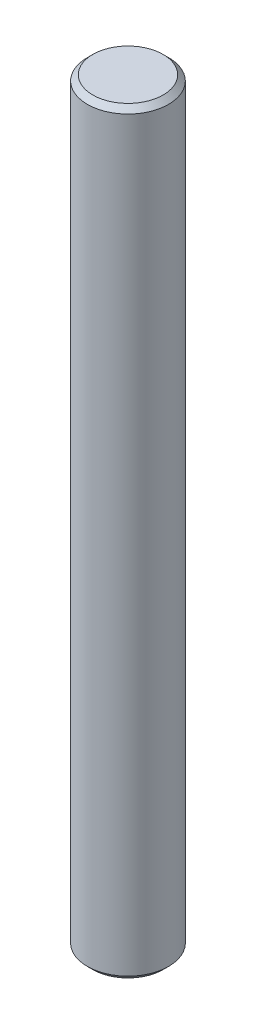
ISO-10303-21;
HEADER;
FILE_DESCRIPTION(('STEP AP214'),'2;1');
FILE_NAME('part.step','',(''),(''),'','','');
FILE_SCHEMA(('AUTOMOTIVE_DESIGN { 1 0 10303 214 1 1 1 1 }'));
ENDSEC;
DATA;
#1=APPLICATION_CONTEXT('core data for automotive mechanical design processes');
#2=APPLICATION_PROTOCOL_DEFINITION('international standard','automotive_design',2000,#1);
#3=PRODUCT_CONTEXT('',#1,'mechanical');
#4=PRODUCT('Part','Part','',(#3));
#5=PRODUCT_RELATED_PRODUCT_CATEGORY('part','',(#4));
#6=PRODUCT_DEFINITION_FORMATION('','',#4);
#7=PRODUCT_DEFINITION_CONTEXT('part definition',#1,'design');
#8=PRODUCT_DEFINITION('design','',#6,#7);
#9=PRODUCT_DEFINITION_SHAPE('','',#8);
#10=(LENGTH_UNIT() NAMED_UNIT(*) SI_UNIT(.MILLI.,.METRE.));
#11=(NAMED_UNIT(*) PLANE_ANGLE_UNIT() SI_UNIT($,.RADIAN.));
#12=(NAMED_UNIT(*) SI_UNIT($,.STERADIAN.) SOLID_ANGLE_UNIT());
#13=UNCERTAINTY_MEASURE_WITH_UNIT(LENGTH_MEASURE(1.E-05),#10,'distance_accuracy_value','');
#14=(GEOMETRIC_REPRESENTATION_CONTEXT(3) GLOBAL_UNCERTAINTY_ASSIGNED_CONTEXT((#13)) GLOBAL_UNIT_ASSIGNED_CONTEXT((#10,
#11,#12)) REPRESENTATION_CONTEXT('',''));
#15=CARTESIAN_POINT('',(0.,0.,0.));
#16=DIRECTION('',(0.,0.,1.));
#17=DIRECTION('',(1.,0.,0.));
#18=AXIS2_PLACEMENT_3D('',#15,#16,#17);
#19=CARTESIAN_POINT('',(0.,14.,0.));
#20=DIRECTION('',(0.,-1.,0.));
#21=DIRECTION('',(0.,0.,-1.));
#22=AXIS2_PLACEMENT_3D('',#19,#20,#21);
#23=CYLINDRICAL_SURFACE('',#22,1.5);
#24=CARTESIAN_POINT('',(0.,-13.8,0.));
#25=DIRECTION('',(0.,1.,0.));
#26=DIRECTION('',(0.,0.,1.));
#27=AXIS2_PLACEMENT_3D('',#24,#25,#26);
#28=CIRCLE('',#27,1.5);
#29=CARTESIAN_POINT('',(0.,-13.8,1.5));
#30=VERTEX_POINT('',#29);
#31=EDGE_CURVE('E45',#30,#30,#28,.T.);
#32=ORIENTED_EDGE('',*,*,#31,.T.);
#33=EDGE_LOOP('',(#32));
#34=FACE_BOUND('',#33,.T.);
#35=CARTESIAN_POINT('',(0.,13.8,0.));
#36=DIRECTION('',(0.,1.,0.));
#37=DIRECTION('',(0.,0.,1.));
#38=AXIS2_PLACEMENT_3D('',#35,#36,#37);
#39=CIRCLE('',#38,1.5);
#40=CARTESIAN_POINT('',(0.,13.8,1.5));
#41=VERTEX_POINT('',#40);
#42=EDGE_CURVE('E49',#41,#41,#39,.F.);
#43=ORIENTED_EDGE('',*,*,#42,.T.);
#44=EDGE_LOOP('',(#43));
#45=FACE_BOUND('',#44,.T.);
#46=ADVANCED_FACE('F34',(#34,#45),#23,.T.);
#47=CARTESIAN_POINT('',(0.,14.,0.));
#48=DIRECTION('',(0.,1.,0.));
#49=DIRECTION('',(0.,0.,1.));
#50=AXIS2_PLACEMENT_3D('',#47,#48,#49);
#51=PLANE('',#50);
#52=CARTESIAN_POINT('',(0.,14.,0.));
#53=DIRECTION('',(0.,1.,0.));
#54=DIRECTION('',(0.,0.,1.));
#55=AXIS2_PLACEMENT_3D('',#52,#53,#54);
#56=CIRCLE('',#55,1.3);
#57=CARTESIAN_POINT('',(0.,14.,1.3));
#58=VERTEX_POINT('',#57);
#59=EDGE_CURVE('E10',#58,#58,#56,.T.);
#60=ORIENTED_EDGE('',*,*,#59,.T.);
#61=EDGE_LOOP('',(#60));
#62=FACE_BOUND('',#61,.T.);
#63=ADVANCED_FACE('F65',(#62),#51,.T.);
#64=CARTESIAN_POINT('',(0.,-14.,0.));
#65=DIRECTION('',(0.,1.,0.));
#66=DIRECTION('',(0.,0.,1.));
#67=AXIS2_PLACEMENT_3D('',#64,#65,#66);
#68=PLANE('',#67);
#69=CARTESIAN_POINT('',(0.,-14.,0.));
#70=DIRECTION('',(0.,1.,0.));
#71=DIRECTION('',(0.,0.,1.));
#72=AXIS2_PLACEMENT_3D('',#69,#70,#71);
#73=CIRCLE('',#72,1.30000000000001);
#74=CARTESIAN_POINT('',(0.,-14.,1.30000000000001));
#75=VERTEX_POINT('',#74);
#76=EDGE_CURVE('E41',#75,#75,#73,.F.);
#77=ORIENTED_EDGE('',*,*,#76,.T.);
#78=EDGE_LOOP('',(#77));
#79=FACE_BOUND('',#78,.T.);
#80=ADVANCED_FACE('F62',(#79),#68,.F.);
#81=CARTESIAN_POINT('',(0.,-13.8,0.));
#82=DIRECTION('',(0.,1.,0.));
#83=DIRECTION('',(0.,0.,1.));
#84=AXIS2_PLACEMENT_3D('',#81,#82,#83);
#85=CONICAL_SURFACE('',#84,1.5,0.785398163397446);
#86=ORIENTED_EDGE('',*,*,#76,.F.);
#87=EDGE_LOOP('',(#86));
#88=FACE_BOUND('',#87,.T.);
#89=ORIENTED_EDGE('',*,*,#31,.F.);
#90=EDGE_LOOP('',(#89));
#91=FACE_BOUND('',#90,.T.);
#92=ADVANCED_FACE('F58',(#88,#91),#85,.T.);
#93=CARTESIAN_POINT('',(0.,14.,0.));
#94=DIRECTION('',(0.,-1.,0.));
#95=DIRECTION('',(0.,0.,-1.));
#96=AXIS2_PLACEMENT_3D('',#93,#94,#95);
#97=CONICAL_SURFACE('',#96,1.3,0.785398163397446);
#98=ORIENTED_EDGE('',*,*,#42,.F.);
#99=EDGE_LOOP('',(#98));
#100=FACE_BOUND('',#99,.T.);
#101=ORIENTED_EDGE('',*,*,#59,.F.);
#102=EDGE_LOOP('',(#101));
#103=FACE_BOUND('',#102,.T.);
#104=ADVANCED_FACE('F36',(#100,#103),#97,.T.);
#105=CLOSED_SHELL('',(#46,#63,#80,#92,#104));
#106=MANIFOLD_SOLID_BREP('B2',#105);
#107=ADVANCED_BREP_SHAPE_REPRESENTATION('',(#18,#106),#14);
#108=SHAPE_DEFINITION_REPRESENTATION(#9,#107);
ENDSEC;
END-ISO-10303-21;
